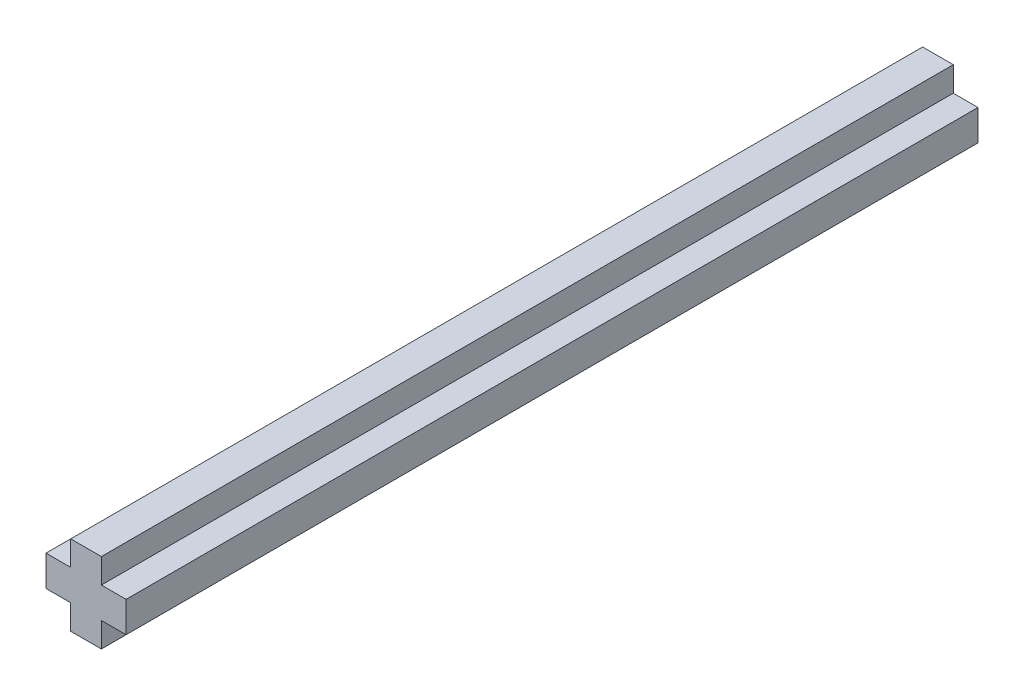
ISO-10303-21;
HEADER;
FILE_DESCRIPTION(('STEP AP214'),'2;1');
FILE_NAME('part.step','',(''),(''),'','','');
FILE_SCHEMA(('AUTOMOTIVE_DESIGN { 1 0 10303 214 1 1 1 1 }'));
ENDSEC;
DATA;
#1=APPLICATION_CONTEXT('core data for automotive mechanical design processes');
#2=APPLICATION_PROTOCOL_DEFINITION('international standard','automotive_design',2000,#1);
#3=PRODUCT_CONTEXT('',#1,'mechanical');
#4=PRODUCT('Part','Part','',(#3));
#5=PRODUCT_RELATED_PRODUCT_CATEGORY('part','',(#4));
#6=PRODUCT_DEFINITION_FORMATION('','',#4);
#7=PRODUCT_DEFINITION_CONTEXT('part definition',#1,'design');
#8=PRODUCT_DEFINITION('design','',#6,#7);
#9=PRODUCT_DEFINITION_SHAPE('','',#8);
#10=(LENGTH_UNIT() NAMED_UNIT(*) SI_UNIT(.MILLI.,.METRE.));
#11=(NAMED_UNIT(*) PLANE_ANGLE_UNIT() SI_UNIT($,.RADIAN.));
#12=(NAMED_UNIT(*) SI_UNIT($,.STERADIAN.) SOLID_ANGLE_UNIT());
#13=UNCERTAINTY_MEASURE_WITH_UNIT(LENGTH_MEASURE(1.E-05),#10,'distance_accuracy_value','');
#14=(GEOMETRIC_REPRESENTATION_CONTEXT(3) GLOBAL_UNCERTAINTY_ASSIGNED_CONTEXT((#13)) GLOBAL_UNIT_ASSIGNED_CONTEXT((#10,
#11,#12)) REPRESENTATION_CONTEXT('',''));
#15=CARTESIAN_POINT('',(0.,0.,0.));
#16=DIRECTION('',(0.,0.,1.));
#17=DIRECTION('',(1.,0.,0.));
#18=AXIS2_PLACEMENT_3D('',#15,#16,#17);
#19=CARTESIAN_POINT('',(0.899999999999999,2.35,50.));
#20=DIRECTION('',(0.,-1.,0.));
#21=DIRECTION('',(1.,0.,0.));
#22=AXIS2_PLACEMENT_3D('',#19,#20,#21);
#23=PLANE('',#22);
#24=DIRECTION('',(-1.,0.,0.));
#25=VECTOR('',#24,1.);
#26=CARTESIAN_POINT('',(0.899999999999999,2.35,0.));
#27=LINE('',#26,#25);
#28=CARTESIAN_POINT('',(0.899999999999999,2.35,0.));
#29=VERTEX_POINT('',#28);
#30=CARTESIAN_POINT('',(-0.900000000000001,2.35,0.));
#31=VERTEX_POINT('',#30);
#32=EDGE_CURVE('E164',#29,#31,#27,.T.);
#33=ORIENTED_EDGE('',*,*,#32,.T.);
#34=DIRECTION('',(0.,0.,-1.));
#35=VECTOR('',#34,1.);
#36=CARTESIAN_POINT('',(-0.900000000000001,2.35,50.));
#37=LINE('',#36,#35);
#38=CARTESIAN_POINT('',(-0.900000000000001,2.35,50.));
#39=VERTEX_POINT('',#38);
#40=EDGE_CURVE('E11',#39,#31,#37,.T.);
#41=ORIENTED_EDGE('',*,*,#40,.F.);
#42=DIRECTION('',(-1.,0.,0.));
#43=VECTOR('',#42,1.);
#44=CARTESIAN_POINT('',(0.899999999999999,2.35,50.));
#45=LINE('',#44,#43);
#46=CARTESIAN_POINT('',(0.899999999999999,2.35,50.));
#47=VERTEX_POINT('',#46);
#48=EDGE_CURVE('E198',#47,#39,#45,.T.);
#49=ORIENTED_EDGE('',*,*,#48,.F.);
#50=DIRECTION('',(0.,0.,-1.));
#51=VECTOR('',#50,1.);
#52=CARTESIAN_POINT('',(0.899999999999999,2.35,50.));
#53=LINE('',#52,#51);
#54=EDGE_CURVE('E160',#47,#29,#53,.T.);
#55=ORIENTED_EDGE('',*,*,#54,.T.);
#56=EDGE_LOOP('',(#33,#41,#49,#55));
#57=FACE_BOUND('',#56,.T.);
#58=ADVANCED_FACE('F39',(#57),#23,.F.);
#59=CARTESIAN_POINT('',(-0.900000000000001,2.35,50.));
#60=DIRECTION('',(1.,0.,0.));
#61=DIRECTION('',(0.,1.,0.));
#62=AXIS2_PLACEMENT_3D('',#59,#60,#61);
#63=PLANE('',#62);
#64=DIRECTION('',(0.,-1.,0.));
#65=VECTOR('',#64,1.);
#66=CARTESIAN_POINT('',(-0.900000000000001,2.35,0.));
#67=LINE('',#66,#65);
#68=CARTESIAN_POINT('',(-0.9,0.9,0.));
#69=VERTEX_POINT('',#68);
#70=EDGE_CURVE('E168',#31,#69,#67,.T.);
#71=ORIENTED_EDGE('',*,*,#70,.T.);
#72=DIRECTION('',(0.,0.,-1.));
#73=VECTOR('',#72,1.);
#74=CARTESIAN_POINT('',(-0.9,0.9,50.));
#75=LINE('',#74,#73);
#76=CARTESIAN_POINT('',(-0.9,0.9,50.));
#77=VERTEX_POINT('',#76);
#78=EDGE_CURVE('E48',#77,#69,#75,.T.);
#79=ORIENTED_EDGE('',*,*,#78,.F.);
#80=DIRECTION('',(0.,-1.,0.));
#81=VECTOR('',#80,1.);
#82=CARTESIAN_POINT('',(-0.900000000000001,2.35,50.));
#83=LINE('',#82,#81);
#84=EDGE_CURVE('E111',#39,#77,#83,.T.);
#85=ORIENTED_EDGE('',*,*,#84,.F.);
#86=ORIENTED_EDGE('',*,*,#40,.T.);
#87=EDGE_LOOP('',(#71,#79,#85,#86));
#88=FACE_BOUND('',#87,.T.);
#89=ADVANCED_FACE('F292',(#88),#63,.F.);
#90=CARTESIAN_POINT('',(-0.9,0.9,50.));
#91=DIRECTION('',(0.,-1.,0.));
#92=DIRECTION('',(1.,0.,0.));
#93=AXIS2_PLACEMENT_3D('',#90,#91,#92);
#94=PLANE('',#93);
#95=DIRECTION('',(-1.,0.,0.));
#96=VECTOR('',#95,1.);
#97=CARTESIAN_POINT('',(-0.9,0.9,0.));
#98=LINE('',#97,#96);
#99=CARTESIAN_POINT('',(-2.35,0.899999999999999,0.));
#100=VERTEX_POINT('',#99);
#101=EDGE_CURVE('E171',#69,#100,#98,.T.);
#102=ORIENTED_EDGE('',*,*,#101,.T.);
#103=DIRECTION('',(0.,0.,-1.));
#104=VECTOR('',#103,1.);
#105=CARTESIAN_POINT('',(-2.35,0.899999999999999,50.));
#106=LINE('',#105,#104);
#107=CARTESIAN_POINT('',(-2.35,0.899999999999999,50.));
#108=VERTEX_POINT('',#107);
#109=EDGE_CURVE('E225',#108,#100,#106,.T.);
#110=ORIENTED_EDGE('',*,*,#109,.F.);
#111=DIRECTION('',(-1.,0.,0.));
#112=VECTOR('',#111,1.);
#113=CARTESIAN_POINT('',(-0.9,0.9,50.));
#114=LINE('',#113,#112);
#115=EDGE_CURVE('E235',#77,#108,#114,.T.);
#116=ORIENTED_EDGE('',*,*,#115,.F.);
#117=ORIENTED_EDGE('',*,*,#78,.T.);
#118=EDGE_LOOP('',(#102,#110,#116,#117));
#119=FACE_BOUND('',#118,.T.);
#120=ADVANCED_FACE('F233',(#119),#94,.F.);
#121=CARTESIAN_POINT('',(-2.35,0.899999999999999,50.));
#122=DIRECTION('',(1.,0.,0.));
#123=DIRECTION('',(0.,1.,0.));
#124=AXIS2_PLACEMENT_3D('',#121,#122,#123);
#125=PLANE('',#124);
#126=DIRECTION('',(0.,-1.,0.));
#127=VECTOR('',#126,1.);
#128=CARTESIAN_POINT('',(-2.35,0.899999999999999,0.));
#129=LINE('',#128,#127);
#130=CARTESIAN_POINT('',(-2.35,-0.9,0.));
#131=VERTEX_POINT('',#130);
#132=EDGE_CURVE('E174',#100,#131,#129,.T.);
#133=ORIENTED_EDGE('',*,*,#132,.T.);
#134=DIRECTION('',(0.,0.,-1.));
#135=VECTOR('',#134,1.);
#136=CARTESIAN_POINT('',(-2.35,-0.9,50.));
#137=LINE('',#136,#135);
#138=CARTESIAN_POINT('',(-2.35,-0.9,50.));
#139=VERTEX_POINT('',#138);
#140=EDGE_CURVE('E221',#139,#131,#137,.T.);
#141=ORIENTED_EDGE('',*,*,#140,.F.);
#142=DIRECTION('',(0.,-1.,0.));
#143=VECTOR('',#142,1.);
#144=CARTESIAN_POINT('',(-2.35,0.899999999999999,50.));
#145=LINE('',#144,#143);
#146=EDGE_CURVE('E254',#108,#139,#145,.T.);
#147=ORIENTED_EDGE('',*,*,#146,.F.);
#148=ORIENTED_EDGE('',*,*,#109,.T.);
#149=EDGE_LOOP('',(#133,#141,#147,#148));
#150=FACE_BOUND('',#149,.T.);
#151=ADVANCED_FACE('F244',(#150),#125,.F.);
#152=CARTESIAN_POINT('',(-2.35,-0.9,50.));
#153=DIRECTION('',(0.,1.,0.));
#154=DIRECTION('',(-1.,0.,0.));
#155=AXIS2_PLACEMENT_3D('',#152,#153,#154);
#156=PLANE('',#155);
#157=DIRECTION('',(1.,0.,0.));
#158=VECTOR('',#157,1.);
#159=CARTESIAN_POINT('',(-2.35,-0.9,0.));
#160=LINE('',#159,#158);
#161=CARTESIAN_POINT('',(-0.899999999999999,-0.9,0.));
#162=VERTEX_POINT('',#161);
#163=EDGE_CURVE('E177',#131,#162,#160,.T.);
#164=ORIENTED_EDGE('',*,*,#163,.T.);
#165=DIRECTION('',(0.,0.,-1.));
#166=VECTOR('',#165,1.);
#167=CARTESIAN_POINT('',(-0.899999999999999,-0.9,50.));
#168=LINE('',#167,#166);
#169=CARTESIAN_POINT('',(-0.899999999999999,-0.9,50.));
#170=VERTEX_POINT('',#169);
#171=EDGE_CURVE('E217',#170,#162,#168,.T.);
#172=ORIENTED_EDGE('',*,*,#171,.F.);
#173=DIRECTION('',(1.,0.,0.));
#174=VECTOR('',#173,1.);
#175=CARTESIAN_POINT('',(-2.35,-0.9,50.));
#176=LINE('',#175,#174);
#177=EDGE_CURVE('E250',#139,#170,#176,.T.);
#178=ORIENTED_EDGE('',*,*,#177,.F.);
#179=ORIENTED_EDGE('',*,*,#140,.T.);
#180=EDGE_LOOP('',(#164,#172,#178,#179));
#181=FACE_BOUND('',#180,.T.);
#182=ADVANCED_FACE('F248',(#181),#156,.F.);
#183=CARTESIAN_POINT('',(-0.899999999999999,-0.9,50.));
#184=DIRECTION('',(1.,0.,0.));
#185=DIRECTION('',(0.,1.,0.));
#186=AXIS2_PLACEMENT_3D('',#183,#184,#185);
#187=PLANE('',#186);
#188=DIRECTION('',(0.,-1.,0.));
#189=VECTOR('',#188,1.);
#190=CARTESIAN_POINT('',(-0.899999999999999,-0.9,0.));
#191=LINE('',#190,#189);
#192=CARTESIAN_POINT('',(-0.900000000000001,-2.35,0.));
#193=VERTEX_POINT('',#192);
#194=EDGE_CURVE('E180',#162,#193,#191,.T.);
#195=ORIENTED_EDGE('',*,*,#194,.T.);
#196=DIRECTION('',(0.,0.,-1.));
#197=VECTOR('',#196,1.);
#198=CARTESIAN_POINT('',(-0.900000000000001,-2.35,50.));
#199=LINE('',#198,#197);
#200=CARTESIAN_POINT('',(-0.900000000000001,-2.35,50.));
#201=VERTEX_POINT('',#200);
#202=EDGE_CURVE('E213',#201,#193,#199,.T.);
#203=ORIENTED_EDGE('',*,*,#202,.F.);
#204=DIRECTION('',(0.,-1.,0.));
#205=VECTOR('',#204,1.);
#206=CARTESIAN_POINT('',(-0.899999999999999,-0.9,50.));
#207=LINE('',#206,#205);
#208=EDGE_CURVE('E253',#170,#201,#207,.T.);
#209=ORIENTED_EDGE('',*,*,#208,.F.);
#210=ORIENTED_EDGE('',*,*,#171,.T.);
#211=EDGE_LOOP('',(#195,#203,#209,#210));
#212=FACE_BOUND('',#211,.T.);
#213=ADVANCED_FACE('F305',(#212),#187,.F.);
#214=CARTESIAN_POINT('',(-0.900000000000001,-2.35,50.));
#215=DIRECTION('',(0.,1.,0.));
#216=DIRECTION('',(-1.,0.,0.));
#217=AXIS2_PLACEMENT_3D('',#214,#215,#216);
#218=PLANE('',#217);
#219=DIRECTION('',(1.,0.,0.));
#220=VECTOR('',#219,1.);
#221=CARTESIAN_POINT('',(-0.900000000000001,-2.35,0.));
#222=LINE('',#221,#220);
#223=CARTESIAN_POINT('',(0.899999999999999,-2.35,0.));
#224=VERTEX_POINT('',#223);
#225=EDGE_CURVE('E183',#193,#224,#222,.T.);
#226=ORIENTED_EDGE('',*,*,#225,.T.);
#227=DIRECTION('',(0.,0.,-1.));
#228=VECTOR('',#227,1.);
#229=CARTESIAN_POINT('',(0.899999999999999,-2.35,50.));
#230=LINE('',#229,#228);
#231=CARTESIAN_POINT('',(0.899999999999999,-2.35,50.));
#232=VERTEX_POINT('',#231);
#233=EDGE_CURVE('E209',#232,#224,#230,.T.);
#234=ORIENTED_EDGE('',*,*,#233,.F.);
#235=DIRECTION('',(1.,0.,0.));
#236=VECTOR('',#235,1.);
#237=CARTESIAN_POINT('',(-0.900000000000001,-2.35,50.));
#238=LINE('',#237,#236);
#239=EDGE_CURVE('E258',#201,#232,#238,.T.);
#240=ORIENTED_EDGE('',*,*,#239,.F.);
#241=ORIENTED_EDGE('',*,*,#202,.T.);
#242=EDGE_LOOP('',(#226,#234,#240,#241));
#243=FACE_BOUND('',#242,.T.);
#244=ADVANCED_FACE('F308',(#243),#218,.F.);
#245=CARTESIAN_POINT('',(0.899999999999999,-2.35,50.));
#246=DIRECTION('',(-1.,0.,0.));
#247=DIRECTION('',(0.,-1.,0.));
#248=AXIS2_PLACEMENT_3D('',#245,#246,#247);
#249=PLANE('',#248);
#250=DIRECTION('',(0.,1.,0.));
#251=VECTOR('',#250,1.);
#252=CARTESIAN_POINT('',(0.899999999999999,-2.35,0.));
#253=LINE('',#252,#251);
#254=CARTESIAN_POINT('',(0.9,-0.9,0.));
#255=VERTEX_POINT('',#254);
#256=EDGE_CURVE('E186',#224,#255,#253,.T.);
#257=ORIENTED_EDGE('',*,*,#256,.T.);
#258=DIRECTION('',(0.,0.,-1.));
#259=VECTOR('',#258,1.);
#260=CARTESIAN_POINT('',(0.9,-0.9,50.));
#261=LINE('',#260,#259);
#262=CARTESIAN_POINT('',(0.9,-0.9,50.));
#263=VERTEX_POINT('',#262);
#264=EDGE_CURVE('E205',#263,#255,#261,.T.);
#265=ORIENTED_EDGE('',*,*,#264,.F.);
#266=DIRECTION('',(0.,1.,0.));
#267=VECTOR('',#266,1.);
#268=CARTESIAN_POINT('',(0.899999999999999,-2.35,50.));
#269=LINE('',#268,#267);
#270=EDGE_CURVE('E265',#232,#263,#269,.T.);
#271=ORIENTED_EDGE('',*,*,#270,.F.);
#272=ORIENTED_EDGE('',*,*,#233,.T.);
#273=EDGE_LOOP('',(#257,#265,#271,#272));
#274=FACE_BOUND('',#273,.T.);
#275=ADVANCED_FACE('F273',(#274),#249,.F.);
#276=CARTESIAN_POINT('',(0.9,-0.9,50.));
#277=DIRECTION('',(0.,1.,0.));
#278=DIRECTION('',(0.,0.,1.));
#279=AXIS2_PLACEMENT_3D('',#276,#277,#278);
#280=PLANE('',#279);
#281=DIRECTION('',(1.,0.,0.));
#282=VECTOR('',#281,1.);
#283=CARTESIAN_POINT('',(0.9,-0.9,0.));
#284=LINE('',#283,#282);
#285=CARTESIAN_POINT('',(2.35,-0.9,0.));
#286=VERTEX_POINT('',#285);
#287=EDGE_CURVE('E189',#255,#286,#284,.T.);
#288=ORIENTED_EDGE('',*,*,#287,.T.);
#289=DIRECTION('',(0.,0.,-1.));
#290=VECTOR('',#289,1.);
#291=CARTESIAN_POINT('',(2.35,-0.9,50.));
#292=LINE('',#291,#290);
#293=CARTESIAN_POINT('',(2.35,-0.9,50.));
#294=VERTEX_POINT('',#293);
#295=EDGE_CURVE('E153',#294,#286,#292,.T.);
#296=ORIENTED_EDGE('',*,*,#295,.F.);
#297=DIRECTION('',(1.,0.,0.));
#298=VECTOR('',#297,1.);
#299=CARTESIAN_POINT('',(0.9,-0.9,50.));
#300=LINE('',#299,#298);
#301=EDGE_CURVE('E142',#263,#294,#300,.T.);
#302=ORIENTED_EDGE('',*,*,#301,.F.);
#303=ORIENTED_EDGE('',*,*,#264,.T.);
#304=EDGE_LOOP('',(#288,#296,#302,#303));
#305=FACE_BOUND('',#304,.T.);
#306=ADVANCED_FACE('F277',(#305),#280,.F.);
#307=CARTESIAN_POINT('',(2.35,-0.9,50.));
#308=DIRECTION('',(-1.,0.,0.));
#309=DIRECTION('',(0.,-1.,0.));
#310=AXIS2_PLACEMENT_3D('',#307,#308,#309);
#311=PLANE('',#310);
#312=DIRECTION('',(0.,1.,0.));
#313=VECTOR('',#312,1.);
#314=CARTESIAN_POINT('',(2.35,-0.9,0.));
#315=LINE('',#314,#313);
#316=CARTESIAN_POINT('',(2.35,0.9,0.));
#317=VERTEX_POINT('',#316);
#318=EDGE_CURVE('E151',#286,#317,#315,.T.);
#319=ORIENTED_EDGE('',*,*,#318,.T.);
#320=DIRECTION('',(0.,0.,-1.));
#321=VECTOR('',#320,1.);
#322=CARTESIAN_POINT('',(2.35,0.9,50.));
#323=LINE('',#322,#321);
#324=CARTESIAN_POINT('',(2.35,0.9,50.));
#325=VERTEX_POINT('',#324);
#326=EDGE_CURVE('E148',#325,#317,#323,.T.);
#327=ORIENTED_EDGE('',*,*,#326,.F.);
#328=DIRECTION('',(0.,1.,0.));
#329=VECTOR('',#328,1.);
#330=CARTESIAN_POINT('',(2.35,-0.9,50.));
#331=LINE('',#330,#329);
#332=EDGE_CURVE('E136',#294,#325,#331,.T.);
#333=ORIENTED_EDGE('',*,*,#332,.F.);
#334=ORIENTED_EDGE('',*,*,#295,.T.);
#335=EDGE_LOOP('',(#319,#327,#333,#334));
#336=FACE_BOUND('',#335,.T.);
#337=ADVANCED_FACE('F149',(#336),#311,.F.);
#338=CARTESIAN_POINT('',(2.35,0.9,50.));
#339=DIRECTION('',(0.,-1.,0.));
#340=DIRECTION('',(1.,0.,0.));
#341=AXIS2_PLACEMENT_3D('',#338,#339,#340);
#342=PLANE('',#341);
#343=DIRECTION('',(-1.,0.,0.));
#344=VECTOR('',#343,1.);
#345=CARTESIAN_POINT('',(2.35,0.9,0.));
#346=LINE('',#345,#344);
#347=CARTESIAN_POINT('',(0.9,0.9,0.));
#348=VERTEX_POINT('',#347);
#349=EDGE_CURVE('E97',#317,#348,#346,.T.);
#350=ORIENTED_EDGE('',*,*,#349,.T.);
#351=DIRECTION('',(0.,0.,-1.));
#352=VECTOR('',#351,1.);
#353=CARTESIAN_POINT('',(0.9,0.9,50.));
#354=LINE('',#353,#352);
#355=CARTESIAN_POINT('',(0.9,0.9,50.));
#356=VERTEX_POINT('',#355);
#357=EDGE_CURVE('E154',#356,#348,#354,.T.);
#358=ORIENTED_EDGE('',*,*,#357,.F.);
#359=DIRECTION('',(-1.,0.,0.));
#360=VECTOR('',#359,1.);
#361=CARTESIAN_POINT('',(2.35,0.9,50.));
#362=LINE('',#361,#360);
#363=EDGE_CURVE('E140',#325,#356,#362,.T.);
#364=ORIENTED_EDGE('',*,*,#363,.F.);
#365=ORIENTED_EDGE('',*,*,#326,.T.);
#366=EDGE_LOOP('',(#350,#358,#364,#365));
#367=FACE_BOUND('',#366,.T.);
#368=ADVANCED_FACE('F156',(#367),#342,.F.);
#369=CARTESIAN_POINT('',(0.9,0.9,50.));
#370=DIRECTION('',(-1.,0.,0.));
#371=DIRECTION('',(0.,-1.,0.));
#372=AXIS2_PLACEMENT_3D('',#369,#370,#371);
#373=PLANE('',#372);
#374=DIRECTION('',(0.,1.,0.));
#375=VECTOR('',#374,1.);
#376=CARTESIAN_POINT('',(0.9,0.9,0.));
#377=LINE('',#376,#375);
#378=EDGE_CURVE('E103',#348,#29,#377,.T.);
#379=ORIENTED_EDGE('',*,*,#378,.T.);
#380=ORIENTED_EDGE('',*,*,#54,.F.);
#381=DIRECTION('',(0.,1.,0.));
#382=VECTOR('',#381,1.);
#383=CARTESIAN_POINT('',(0.9,0.9,50.));
#384=LINE('',#383,#382);
#385=EDGE_CURVE('E56',#356,#47,#384,.T.);
#386=ORIENTED_EDGE('',*,*,#385,.F.);
#387=ORIENTED_EDGE('',*,*,#357,.T.);
#388=EDGE_LOOP('',(#379,#380,#386,#387));
#389=FACE_BOUND('',#388,.T.);
#390=ADVANCED_FACE('F281',(#389),#373,.F.);
#391=CARTESIAN_POINT('',(0.,0.,50.));
#392=DIRECTION('',(0.,0.,1.));
#393=DIRECTION('',(1.,0.,0.));
#394=AXIS2_PLACEMENT_3D('',#391,#392,#393);
#395=PLANE('',#394);
#396=ORIENTED_EDGE('',*,*,#48,.T.);
#397=ORIENTED_EDGE('',*,*,#84,.T.);
#398=ORIENTED_EDGE('',*,*,#115,.T.);
#399=ORIENTED_EDGE('',*,*,#146,.T.);
#400=ORIENTED_EDGE('',*,*,#177,.T.);
#401=ORIENTED_EDGE('',*,*,#208,.T.);
#402=ORIENTED_EDGE('',*,*,#239,.T.);
#403=ORIENTED_EDGE('',*,*,#270,.T.);
#404=ORIENTED_EDGE('',*,*,#301,.T.);
#405=ORIENTED_EDGE('',*,*,#332,.T.);
#406=ORIENTED_EDGE('',*,*,#363,.T.);
#407=ORIENTED_EDGE('',*,*,#385,.T.);
#408=EDGE_LOOP('',(#396,#397,#398,#399,#400,#401,#402,#403,#404,#405,#406,#407));
#409=FACE_BOUND('',#408,.T.);
#410=ADVANCED_FACE('F138',(#409),#395,.T.);
#411=CARTESIAN_POINT('',(0.,0.,0.));
#412=DIRECTION('',(0.,0.,1.));
#413=DIRECTION('',(1.,0.,0.));
#414=AXIS2_PLACEMENT_3D('',#411,#412,#413);
#415=PLANE('',#414);
#416=ORIENTED_EDGE('',*,*,#32,.F.);
#417=ORIENTED_EDGE('',*,*,#378,.F.);
#418=ORIENTED_EDGE('',*,*,#349,.F.);
#419=ORIENTED_EDGE('',*,*,#318,.F.);
#420=ORIENTED_EDGE('',*,*,#287,.F.);
#421=ORIENTED_EDGE('',*,*,#256,.F.);
#422=ORIENTED_EDGE('',*,*,#225,.F.);
#423=ORIENTED_EDGE('',*,*,#194,.F.);
#424=ORIENTED_EDGE('',*,*,#163,.F.);
#425=ORIENTED_EDGE('',*,*,#132,.F.);
#426=ORIENTED_EDGE('',*,*,#101,.F.);
#427=ORIENTED_EDGE('',*,*,#70,.F.);
#428=EDGE_LOOP('',(#416,#417,#418,#419,#420,#421,#422,#423,#424,#425,#426,#427));
#429=FACE_BOUND('',#428,.T.);
#430=ADVANCED_FACE('F239',(#429),#415,.F.);
#431=CLOSED_SHELL('',(#58,#89,#120,#151,#182,#213,#244,#275,#306,#337,#368,#390,#410,#430));
#432=MANIFOLD_SOLID_BREP('B2',#431);
#433=ADVANCED_BREP_SHAPE_REPRESENTATION('',(#18,#432),#14);
#434=SHAPE_DEFINITION_REPRESENTATION(#9,#433);
ENDSEC;
END-ISO-10303-21;
